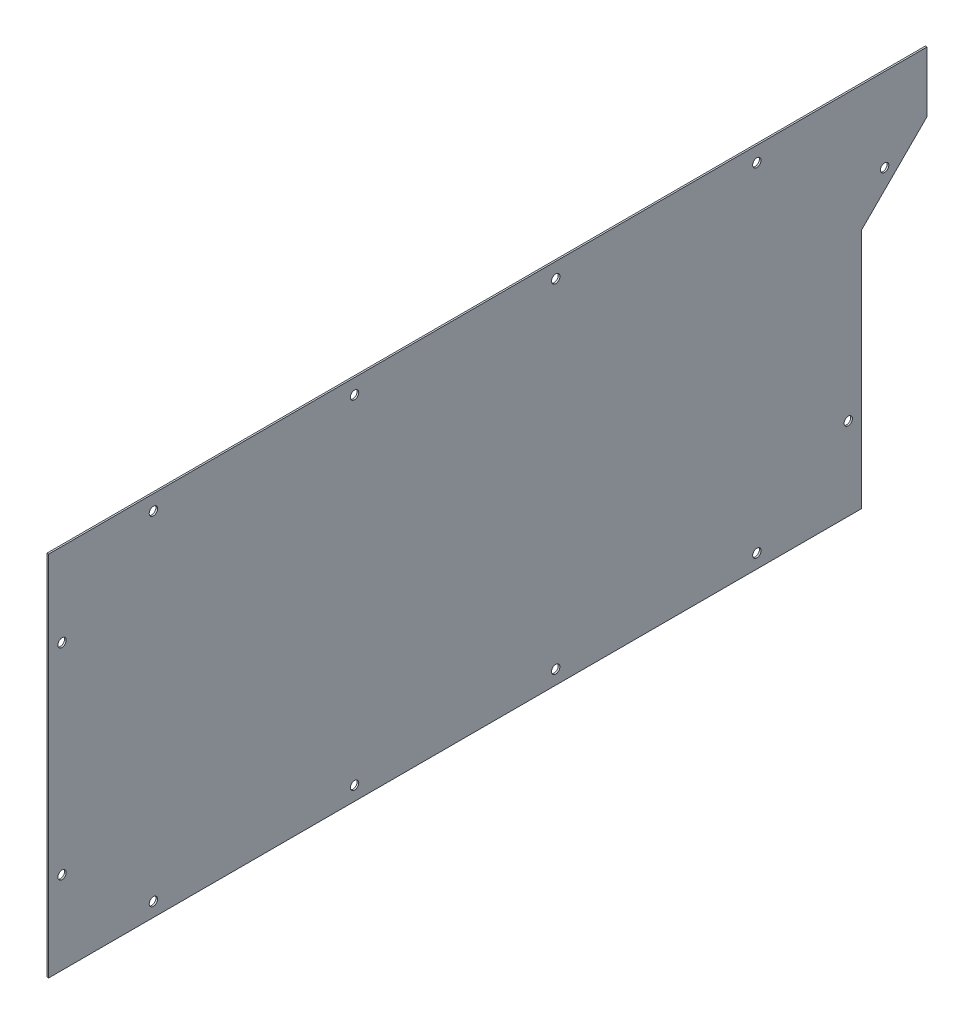
ISO-10303-21;
HEADER;
FILE_DESCRIPTION(('STEP AP214'),'2;1');
FILE_NAME('part.step','',(''),(''),'','','');
FILE_SCHEMA(('AUTOMOTIVE_DESIGN { 1 0 10303 214 1 1 1 1 }'));
ENDSEC;
DATA;
#1=APPLICATION_CONTEXT('core data for automotive mechanical design processes');
#2=APPLICATION_PROTOCOL_DEFINITION('international standard','automotive_design',2000,#1);
#3=PRODUCT_CONTEXT('',#1,'mechanical');
#4=PRODUCT('Part','Part','',(#3));
#5=PRODUCT_RELATED_PRODUCT_CATEGORY('part','',(#4));
#6=PRODUCT_DEFINITION_FORMATION('','',#4);
#7=PRODUCT_DEFINITION_CONTEXT('part definition',#1,'design');
#8=PRODUCT_DEFINITION('design','',#6,#7);
#9=PRODUCT_DEFINITION_SHAPE('','',#8);
#10=(LENGTH_UNIT() NAMED_UNIT(*) SI_UNIT(.MILLI.,.METRE.));
#11=(NAMED_UNIT(*) PLANE_ANGLE_UNIT() SI_UNIT($,.RADIAN.));
#12=(NAMED_UNIT(*) SI_UNIT($,.STERADIAN.) SOLID_ANGLE_UNIT());
#13=UNCERTAINTY_MEASURE_WITH_UNIT(LENGTH_MEASURE(1.E-05),#10,'distance_accuracy_value','');
#14=(GEOMETRIC_REPRESENTATION_CONTEXT(3) GLOBAL_UNCERTAINTY_ASSIGNED_CONTEXT((#13)) GLOBAL_UNIT_ASSIGNED_CONTEXT((#10,
#11,#12)) REPRESENTATION_CONTEXT('',''));
#15=CARTESIAN_POINT('',(0.,0.,0.));
#16=DIRECTION('',(0.,0.,1.));
#17=DIRECTION('',(1.,0.,0.));
#18=AXIS2_PLACEMENT_3D('',#15,#16,#17);
#19=CARTESIAN_POINT('',(1.,73.4999999999999,-262.));
#20=DIRECTION('',(0.,0.,1.));
#21=DIRECTION('',(1.,0.,0.));
#22=AXIS2_PLACEMENT_3D('',#19,#20,#21);
#23=PLANE('',#22);
#24=DIRECTION('',(0.,1.,0.));
#25=VECTOR('',#24,1.);
#26=CARTESIAN_POINT('',(0.,73.4999999999999,-262.));
#27=LINE('',#26,#25);
#28=CARTESIAN_POINT('',(0.,73.4999999999999,-262.));
#29=VERTEX_POINT('',#28);
#30=CARTESIAN_POINT('',(0.,109.5,-262.));
#31=VERTEX_POINT('',#30);
#32=EDGE_CURVE('E117',#29,#31,#27,.T.);
#33=ORIENTED_EDGE('',*,*,#32,.T.);
#34=DIRECTION('',(-1.,0.,0.));
#35=VECTOR('',#34,1.);
#36=CARTESIAN_POINT('',(1.,109.5,-262.));
#37=LINE('',#36,#35);
#38=CARTESIAN_POINT('',(1.,109.5,-262.));
#39=VERTEX_POINT('',#38);
#40=EDGE_CURVE('E11',#39,#31,#37,.T.);
#41=ORIENTED_EDGE('',*,*,#40,.F.);
#42=DIRECTION('',(0.,1.,0.));
#43=VECTOR('',#42,1.);
#44=CARTESIAN_POINT('',(1.,73.4999999999999,-262.));
#45=LINE('',#44,#43);
#46=CARTESIAN_POINT('',(1.,73.4999999999999,-262.));
#47=VERTEX_POINT('',#46);
#48=EDGE_CURVE('E128',#47,#39,#45,.T.);
#49=ORIENTED_EDGE('',*,*,#48,.F.);
#50=DIRECTION('',(-1.,0.,0.));
#51=VECTOR('',#50,1.);
#52=CARTESIAN_POINT('',(1.,73.4999999999999,-262.));
#53=LINE('',#52,#51);
#54=EDGE_CURVE('E113',#47,#29,#53,.T.);
#55=ORIENTED_EDGE('',*,*,#54,.T.);
#56=EDGE_LOOP('',(#33,#41,#49,#55));
#57=FACE_BOUND('',#56,.T.);
#58=ADVANCED_FACE('F33',(#57),#23,.F.);
#59=CARTESIAN_POINT('',(1.,109.5,262.));
#60=DIRECTION('',(0.,-1.,0.));
#61=DIRECTION('',(0.,0.,-1.));
#62=AXIS2_PLACEMENT_3D('',#59,#60,#61);
#63=PLANE('',#62);
#64=DIRECTION('',(0.,0.,1.));
#65=VECTOR('',#64,1.);
#66=CARTESIAN_POINT('',(0.,109.5,262.));
#67=LINE('',#66,#65);
#68=CARTESIAN_POINT('',(0.,109.5,262.));
#69=VERTEX_POINT('',#68);
#70=EDGE_CURVE('E120',#31,#69,#67,.T.);
#71=ORIENTED_EDGE('',*,*,#70,.T.);
#72=DIRECTION('',(-1.,0.,0.));
#73=VECTOR('',#72,1.);
#74=CARTESIAN_POINT('',(1.,109.5,262.));
#75=LINE('',#74,#73);
#76=CARTESIAN_POINT('',(1.,109.5,262.));
#77=VERTEX_POINT('',#76);
#78=EDGE_CURVE('E41',#77,#69,#75,.T.);
#79=ORIENTED_EDGE('',*,*,#78,.F.);
#80=DIRECTION('',(0.,0.,1.));
#81=VECTOR('',#80,1.);
#82=CARTESIAN_POINT('',(1.,109.5,262.));
#83=LINE('',#82,#81);
#84=EDGE_CURVE('E86',#39,#77,#83,.T.);
#85=ORIENTED_EDGE('',*,*,#84,.F.);
#86=ORIENTED_EDGE('',*,*,#40,.T.);
#87=EDGE_LOOP('',(#71,#79,#85,#86));
#88=FACE_BOUND('',#87,.T.);
#89=ADVANCED_FACE('F153',(#88),#63,.F.);
#90=CARTESIAN_POINT('',(1.,-109.5,262.));
#91=DIRECTION('',(0.,0.,-1.));
#92=DIRECTION('',(-1.,0.,0.));
#93=AXIS2_PLACEMENT_3D('',#90,#91,#92);
#94=PLANE('',#93);
#95=DIRECTION('',(0.,-1.,0.));
#96=VECTOR('',#95,1.);
#97=CARTESIAN_POINT('',(0.,-109.5,262.));
#98=LINE('',#97,#96);
#99=CARTESIAN_POINT('',(0.,-109.5,262.));
#100=VERTEX_POINT('',#99);
#101=EDGE_CURVE('E123',#69,#100,#98,.T.);
#102=ORIENTED_EDGE('',*,*,#101,.T.);
#103=DIRECTION('',(-1.,0.,0.));
#104=VECTOR('',#103,1.);
#105=CARTESIAN_POINT('',(1.,-109.5,262.));
#106=LINE('',#105,#104);
#107=CARTESIAN_POINT('',(1.,-109.5,262.));
#108=VERTEX_POINT('',#107);
#109=EDGE_CURVE('E108',#108,#100,#106,.T.);
#110=ORIENTED_EDGE('',*,*,#109,.F.);
#111=DIRECTION('',(0.,-1.,0.));
#112=VECTOR('',#111,1.);
#113=CARTESIAN_POINT('',(1.,-109.5,262.));
#114=LINE('',#113,#112);
#115=EDGE_CURVE('E99',#77,#108,#114,.T.);
#116=ORIENTED_EDGE('',*,*,#115,.F.);
#117=ORIENTED_EDGE('',*,*,#78,.T.);
#118=EDGE_LOOP('',(#102,#110,#116,#117));
#119=FACE_BOUND('',#118,.T.);
#120=ADVANCED_FACE('F134',(#119),#94,.F.);
#121=CARTESIAN_POINT('',(1.,-109.5,262.));
#122=DIRECTION('',(0.,1.,0.));
#123=DIRECTION('',(0.,0.,1.));
#124=AXIS2_PLACEMENT_3D('',#121,#122,#123);
#125=PLANE('',#124);
#126=DIRECTION('',(0.,0.,-1.));
#127=VECTOR('',#126,1.);
#128=CARTESIAN_POINT('',(0.,-109.5,262.));
#129=LINE('',#128,#127);
#130=CARTESIAN_POINT('',(0.,-109.5,-223.));
#131=VERTEX_POINT('',#130);
#132=EDGE_CURVE('E107',#100,#131,#129,.T.);
#133=ORIENTED_EDGE('',*,*,#132,.T.);
#134=DIRECTION('',(-1.,0.,0.));
#135=VECTOR('',#134,1.);
#136=CARTESIAN_POINT('',(1.,-109.5,-223.));
#137=LINE('',#136,#135);
#138=CARTESIAN_POINT('',(1.,-109.5,-223.));
#139=VERTEX_POINT('',#138);
#140=EDGE_CURVE('E104',#139,#131,#137,.T.);
#141=ORIENTED_EDGE('',*,*,#140,.F.);
#142=DIRECTION('',(0.,0.,-1.));
#143=VECTOR('',#142,1.);
#144=CARTESIAN_POINT('',(1.,-109.5,262.));
#145=LINE('',#144,#143);
#146=EDGE_CURVE('E93',#108,#139,#145,.T.);
#147=ORIENTED_EDGE('',*,*,#146,.F.);
#148=ORIENTED_EDGE('',*,*,#109,.T.);
#149=EDGE_LOOP('',(#133,#141,#147,#148));
#150=FACE_BOUND('',#149,.T.);
#151=ADVANCED_FACE('F105',(#150),#125,.F.);
#152=CARTESIAN_POINT('',(1.,-109.5,-223.));
#153=DIRECTION('',(0.,0.,1.));
#154=DIRECTION('',(0.,-1.,0.));
#155=AXIS2_PLACEMENT_3D('',#152,#153,#154);
#156=PLANE('',#155);
#157=DIRECTION('',(0.,1.,0.));
#158=VECTOR('',#157,1.);
#159=CARTESIAN_POINT('',(0.,-109.5,-223.));
#160=LINE('',#159,#158);
#161=CARTESIAN_POINT('',(0.,34.5,-223.));
#162=VERTEX_POINT('',#161);
#163=EDGE_CURVE('E72',#131,#162,#160,.T.);
#164=ORIENTED_EDGE('',*,*,#163,.T.);
#165=DIRECTION('',(-1.,0.,0.));
#166=VECTOR('',#165,1.);
#167=CARTESIAN_POINT('',(1.,34.5,-223.));
#168=LINE('',#167,#166);
#169=CARTESIAN_POINT('',(1.,34.5,-223.));
#170=VERTEX_POINT('',#169);
#171=EDGE_CURVE('E109',#170,#162,#168,.T.);
#172=ORIENTED_EDGE('',*,*,#171,.F.);
#173=DIRECTION('',(0.,1.,0.));
#174=VECTOR('',#173,1.);
#175=CARTESIAN_POINT('',(1.,-109.5,-223.));
#176=LINE('',#175,#174);
#177=EDGE_CURVE('E97',#139,#170,#176,.T.);
#178=ORIENTED_EDGE('',*,*,#177,.F.);
#179=ORIENTED_EDGE('',*,*,#140,.T.);
#180=EDGE_LOOP('',(#164,#172,#178,#179));
#181=FACE_BOUND('',#180,.T.);
#182=ADVANCED_FACE('F111',(#181),#156,.F.);
#183=CARTESIAN_POINT('',(1.,34.5,-223.));
#184=DIRECTION('',(0.,0.707106781186549,0.707106781186546));
#185=DIRECTION('',(0.,-0.707106781186546,0.707106781186549));
#186=AXIS2_PLACEMENT_3D('',#183,#184,#185);
#187=PLANE('',#186);
#188=DIRECTION('',(0.,0.707106781186546,-0.707106781186549));
#189=VECTOR('',#188,1.);
#190=CARTESIAN_POINT('',(0.,34.5,-223.));
#191=LINE('',#190,#189);
#192=EDGE_CURVE('E78',#162,#29,#191,.T.);
#193=ORIENTED_EDGE('',*,*,#192,.T.);
#194=ORIENTED_EDGE('',*,*,#54,.F.);
#195=DIRECTION('',(0.,0.707106781186546,-0.707106781186549));
#196=VECTOR('',#195,1.);
#197=CARTESIAN_POINT('',(1.,34.5,-223.));
#198=LINE('',#197,#196);
#199=EDGE_CURVE('E49',#170,#47,#198,.T.);
#200=ORIENTED_EDGE('',*,*,#199,.F.);
#201=ORIENTED_EDGE('',*,*,#171,.T.);
#202=EDGE_LOOP('',(#193,#194,#200,#201));
#203=FACE_BOUND('',#202,.T.);
#204=ADVANCED_FACE('F141',(#203),#187,.F.);
#205=CARTESIAN_POINT('',(1.,0.,0.));
#206=DIRECTION('',(-1.,0.,0.));
#207=DIRECTION('',(0.,0.,1.));
#208=AXIS2_PLACEMENT_3D('',#205,#206,#207);
#209=PLANE('',#208);
#210=CARTESIAN_POINT('',(1.,59.7928932188117,-236.686291501008));
#211=DIRECTION('',(1.,0.,0.));
#212=DIRECTION('',(0.,0.,-1.));
#213=AXIS2_PLACEMENT_3D('',#210,#211,#212);
#214=CIRCLE('',#213,2.49999999999828);
#215=CARTESIAN_POINT('',(1.,59.7928932188117,-239.186291501006));
#216=VERTEX_POINT('',#215);
#217=EDGE_CURVE('E319',#216,#216,#214,.T.);
#218=ORIENTED_EDGE('',*,*,#217,.F.);
#219=EDGE_LOOP('',(#218));
#220=FACE_BOUND('',#219,.T.);
#221=CARTESIAN_POINT('',(1.,59.7928932188074,254.000000000004));
#222=DIRECTION('',(1.,0.,0.));
#223=DIRECTION('',(0.,0.,-1.));
#224=AXIS2_PLACEMENT_3D('',#221,#222,#223);
#225=CIRCLE('',#224,2.50000000000269);
#226=CARTESIAN_POINT('',(1.,59.7928932188074,251.500000000001));
#227=VERTEX_POINT('',#226);
#228=EDGE_CURVE('E325',#227,#227,#225,.T.);
#229=ORIENTED_EDGE('',*,*,#228,.F.);
#230=EDGE_LOOP('',(#229));
#231=FACE_BOUND('',#230,.T.);
#232=CARTESIAN_POINT('',(1.,-60.2071067811926,254.000000000003));
#233=DIRECTION('',(1.,0.,0.));
#234=DIRECTION('',(0.,0.,-1.));
#235=AXIS2_PLACEMENT_3D('',#232,#233,#234);
#236=CIRCLE('',#235,2.50000000000148);
#237=CARTESIAN_POINT('',(1.,-60.2071067811926,251.500000000001));
#238=VERTEX_POINT('',#237);
#239=EDGE_CURVE('E336',#238,#238,#236,.T.);
#240=ORIENTED_EDGE('',*,*,#239,.F.);
#241=EDGE_LOOP('',(#240));
#242=FACE_BOUND('',#241,.T.);
#243=CARTESIAN_POINT('',(1.,100.5,199.500000000002));
#244=DIRECTION('',(1.,0.,0.));
#245=DIRECTION('',(0.,0.,-1.));
#246=AXIS2_PLACEMENT_3D('',#243,#244,#245);
#247=CIRCLE('',#246,2.50000000000008);
#248=CARTESIAN_POINT('',(1.,100.5,197.000000000002));
#249=VERTEX_POINT('',#248);
#250=EDGE_CURVE('E404',#249,#249,#247,.T.);
#251=ORIENTED_EDGE('',*,*,#250,.F.);
#252=EDGE_LOOP('',(#251));
#253=FACE_BOUND('',#252,.T.);
#254=CARTESIAN_POINT('',(1.,-101.207106781186,-160.5));
#255=DIRECTION('',(1.,0.,0.));
#256=DIRECTION('',(0.,0.,-1.));
#257=AXIS2_PLACEMENT_3D('',#254,#255,#256);
#258=CIRCLE('',#257,2.5);
#259=CARTESIAN_POINT('',(1.,-101.207106781186,-163.));
#260=VERTEX_POINT('',#259);
#261=EDGE_CURVE('E346',#260,#260,#258,.T.);
#262=ORIENTED_EDGE('',*,*,#261,.F.);
#263=EDGE_LOOP('',(#262));
#264=FACE_BOUND('',#263,.T.);
#265=CARTESIAN_POINT('',(1.,-101.207106781187,199.5));
#266=DIRECTION('',(1.,0.,0.));
#267=DIRECTION('',(0.,0.,-1.));
#268=AXIS2_PLACEMENT_3D('',#265,#266,#267);
#269=CIRCLE('',#268,2.5000000000015);
#270=CARTESIAN_POINT('',(1.,-101.207106781187,196.999999999999));
#271=VERTEX_POINT('',#270);
#272=EDGE_CURVE('E353',#271,#271,#269,.T.);
#273=ORIENTED_EDGE('',*,*,#272,.F.);
#274=EDGE_LOOP('',(#273));
#275=FACE_BOUND('',#274,.T.);
#276=CARTESIAN_POINT('',(1.,-101.207106781187,79.5000000000003));
#277=DIRECTION('',(1.,0.,0.));
#278=DIRECTION('',(0.,0.,-1.));
#279=AXIS2_PLACEMENT_3D('',#276,#277,#278);
#280=CIRCLE('',#279,2.50000000000104);
#281=CARTESIAN_POINT('',(1.,-101.207106781187,76.9999999999992));
#282=VERTEX_POINT('',#281);
#283=EDGE_CURVE('E337',#282,#282,#280,.T.);
#284=ORIENTED_EDGE('',*,*,#283,.F.);
#285=EDGE_LOOP('',(#284));
#286=FACE_BOUND('',#285,.T.);
#287=CARTESIAN_POINT('',(1.,-60.2071067811883,-214.999999999992));
#288=DIRECTION('',(1.,0.,0.));
#289=DIRECTION('',(0.,0.,-1.));
#290=AXIS2_PLACEMENT_3D('',#287,#288,#289);
#291=CIRCLE('',#290,2.5);
#292=CARTESIAN_POINT('',(1.,-60.2071067811883,-217.499999999992));
#293=VERTEX_POINT('',#292);
#294=EDGE_CURVE('E323',#293,#293,#291,.T.);
#295=ORIENTED_EDGE('',*,*,#294,.F.);
#296=EDGE_LOOP('',(#295));
#297=FACE_BOUND('',#296,.T.);
#298=CARTESIAN_POINT('',(1.,100.5,79.5000000000017));
#299=DIRECTION('',(1.,0.,0.));
#300=DIRECTION('',(0.,0.,-1.));
#301=AXIS2_PLACEMENT_3D('',#298,#299,#300);
#302=CIRCLE('',#301,2.50000000000005);
#303=CARTESIAN_POINT('',(1.,100.5,77.0000000000017));
#304=VERTEX_POINT('',#303);
#305=EDGE_CURVE('E382',#304,#304,#302,.T.);
#306=ORIENTED_EDGE('',*,*,#305,.F.);
#307=EDGE_LOOP('',(#306));
#308=FACE_BOUND('',#307,.T.);
#309=CARTESIAN_POINT('',(1.,100.500000000001,-40.4999999999983));
#310=DIRECTION('',(1.,0.,0.));
#311=DIRECTION('',(0.,0.,-1.));
#312=AXIS2_PLACEMENT_3D('',#309,#310,#311);
#313=CIRCLE('',#312,2.50000000000006);
#314=CARTESIAN_POINT('',(1.,100.500000000001,-42.9999999999983));
#315=VERTEX_POINT('',#314);
#316=EDGE_CURVE('E386',#315,#315,#313,.T.);
#317=ORIENTED_EDGE('',*,*,#316,.F.);
#318=EDGE_LOOP('',(#317));
#319=FACE_BOUND('',#318,.T.);
#320=CARTESIAN_POINT('',(1.,100.5,-160.499999999998));
#321=DIRECTION('',(1.,0.,0.));
#322=DIRECTION('',(0.,0.,-1.));
#323=AXIS2_PLACEMENT_3D('',#320,#321,#322);
#324=CIRCLE('',#323,2.50000000000008);
#325=CARTESIAN_POINT('',(1.,100.5,-162.999999999998));
#326=VERTEX_POINT('',#325);
#327=EDGE_CURVE('E389',#326,#326,#324,.T.);
#328=ORIENTED_EDGE('',*,*,#327,.F.);
#329=EDGE_LOOP('',(#328));
#330=FACE_BOUND('',#329,.T.);
#331=CARTESIAN_POINT('',(1.,-101.207106781186,-40.4999999999997));
#332=DIRECTION('',(1.,0.,0.));
#333=DIRECTION('',(0.,0.,-1.));
#334=AXIS2_PLACEMENT_3D('',#331,#332,#333);
#335=CIRCLE('',#334,2.50000000000052);
#336=CARTESIAN_POINT('',(1.,-101.207106781186,-43.0000000000003));
#337=VERTEX_POINT('',#336);
#338=EDGE_CURVE('E121',#337,#337,#335,.T.);
#339=ORIENTED_EDGE('',*,*,#338,.F.);
#340=EDGE_LOOP('',(#339));
#341=FACE_BOUND('',#340,.T.);
#342=ORIENTED_EDGE('',*,*,#48,.T.);
#343=ORIENTED_EDGE('',*,*,#84,.T.);
#344=ORIENTED_EDGE('',*,*,#115,.T.);
#345=ORIENTED_EDGE('',*,*,#146,.T.);
#346=ORIENTED_EDGE('',*,*,#177,.T.);
#347=ORIENTED_EDGE('',*,*,#199,.T.);
#348=EDGE_LOOP('',(#342,#343,#344,#345,#346,#347));
#349=FACE_BOUND('',#348,.T.);
#350=ADVANCED_FACE('F95',(#220,#231,#242,#253,#264,#275,#286,#297,#308,#319,#330,#341,#349),
#209,.F.);
#351=CARTESIAN_POINT('',(0.,0.,0.));
#352=DIRECTION('',(-1.,0.,0.));
#353=DIRECTION('',(0.,0.,1.));
#354=AXIS2_PLACEMENT_3D('',#351,#352,#353);
#355=PLANE('',#354);
#356=CARTESIAN_POINT('',(0.,59.7928932188117,-236.686291501008));
#357=DIRECTION('',(-1.,0.,0.));
#358=DIRECTION('',(0.,0.,1.));
#359=AXIS2_PLACEMENT_3D('',#356,#357,#358);
#360=CIRCLE('',#359,2.49999999999828);
#361=CARTESIAN_POINT('',(0.,59.7928932188117,-234.18629150101));
#362=VERTEX_POINT('',#361);
#363=EDGE_CURVE('E316',#362,#362,#360,.F.);
#364=ORIENTED_EDGE('',*,*,#363,.T.);
#365=EDGE_LOOP('',(#364));
#366=FACE_BOUND('',#365,.T.);
#367=CARTESIAN_POINT('',(0.,59.7928932188074,254.000000000004));
#368=DIRECTION('',(-1.,0.,0.));
#369=DIRECTION('',(0.,0.,1.));
#370=AXIS2_PLACEMENT_3D('',#367,#368,#369);
#371=CIRCLE('',#370,2.50000000000269);
#372=CARTESIAN_POINT('',(0.,59.7928932188074,256.500000000007));
#373=VERTEX_POINT('',#372);
#374=EDGE_CURVE('E333',#373,#373,#371,.F.);
#375=ORIENTED_EDGE('',*,*,#374,.T.);
#376=EDGE_LOOP('',(#375));
#377=FACE_BOUND('',#376,.T.);
#378=CARTESIAN_POINT('',(0.,-60.2071067811926,254.000000000003));
#379=DIRECTION('',(-1.,0.,0.));
#380=DIRECTION('',(0.,0.,1.));
#381=AXIS2_PLACEMENT_3D('',#378,#379,#380);
#382=CIRCLE('',#381,2.50000000000148);
#383=CARTESIAN_POINT('',(0.,-60.2071067811926,256.500000000004));
#384=VERTEX_POINT('',#383);
#385=EDGE_CURVE('E402',#384,#384,#382,.F.);
#386=ORIENTED_EDGE('',*,*,#385,.T.);
#387=EDGE_LOOP('',(#386));
#388=FACE_BOUND('',#387,.T.);
#389=CARTESIAN_POINT('',(0.,100.5,199.500000000002));
#390=DIRECTION('',(-1.,0.,0.));
#391=DIRECTION('',(0.,0.,1.));
#392=AXIS2_PLACEMENT_3D('',#389,#390,#391);
#393=CIRCLE('',#392,2.50000000000008);
#394=CARTESIAN_POINT('',(0.,100.5,202.000000000002));
#395=VERTEX_POINT('',#394);
#396=EDGE_CURVE('E328',#395,#395,#393,.F.);
#397=ORIENTED_EDGE('',*,*,#396,.T.);
#398=EDGE_LOOP('',(#397));
#399=FACE_BOUND('',#398,.T.);
#400=CARTESIAN_POINT('',(0.,-101.207106781186,-160.5));
#401=DIRECTION('',(-1.,0.,0.));
#402=DIRECTION('',(0.,0.,1.));
#403=AXIS2_PLACEMENT_3D('',#400,#401,#402);
#404=CIRCLE('',#403,2.5);
#405=CARTESIAN_POINT('',(0.,-101.207106781186,-158.));
#406=VERTEX_POINT('',#405);
#407=EDGE_CURVE('E350',#406,#406,#404,.F.);
#408=ORIENTED_EDGE('',*,*,#407,.T.);
#409=EDGE_LOOP('',(#408));
#410=FACE_BOUND('',#409,.T.);
#411=CARTESIAN_POINT('',(0.,-101.207106781187,199.5));
#412=DIRECTION('',(-1.,0.,0.));
#413=DIRECTION('',(0.,0.,1.));
#414=AXIS2_PLACEMENT_3D('',#411,#412,#413);
#415=CIRCLE('',#414,2.5000000000015);
#416=CARTESIAN_POINT('',(0.,-101.207106781187,202.000000000002));
#417=VERTEX_POINT('',#416);
#418=EDGE_CURVE('E340',#417,#417,#415,.F.);
#419=ORIENTED_EDGE('',*,*,#418,.T.);
#420=EDGE_LOOP('',(#419));
#421=FACE_BOUND('',#420,.T.);
#422=CARTESIAN_POINT('',(0.,-101.207106781187,79.5000000000003));
#423=DIRECTION('',(-1.,0.,0.));
#424=DIRECTION('',(0.,0.,1.));
#425=AXIS2_PLACEMENT_3D('',#422,#423,#424);
#426=CIRCLE('',#425,2.50000000000104);
#427=CARTESIAN_POINT('',(0.,-101.207106781187,82.0000000000013));
#428=VERTEX_POINT('',#427);
#429=EDGE_CURVE('E341',#428,#428,#426,.F.);
#430=ORIENTED_EDGE('',*,*,#429,.T.);
#431=EDGE_LOOP('',(#430));
#432=FACE_BOUND('',#431,.T.);
#433=CARTESIAN_POINT('',(0.,-60.2071067811883,-214.999999999992));
#434=DIRECTION('',(-1.,0.,0.));
#435=DIRECTION('',(0.,0.,1.));
#436=AXIS2_PLACEMENT_3D('',#433,#434,#435);
#437=CIRCLE('',#436,2.5);
#438=CARTESIAN_POINT('',(0.,-60.2071067811883,-212.499999999992));
#439=VERTEX_POINT('',#438);
#440=EDGE_CURVE('E320',#439,#439,#437,.F.);
#441=ORIENTED_EDGE('',*,*,#440,.T.);
#442=EDGE_LOOP('',(#441));
#443=FACE_BOUND('',#442,.T.);
#444=CARTESIAN_POINT('',(0.,100.5,79.5000000000017));
#445=DIRECTION('',(-1.,0.,0.));
#446=DIRECTION('',(0.,0.,1.));
#447=AXIS2_PLACEMENT_3D('',#444,#445,#446);
#448=CIRCLE('',#447,2.50000000000005);
#449=CARTESIAN_POINT('',(0.,100.5,82.0000000000018));
#450=VERTEX_POINT('',#449);
#451=EDGE_CURVE('E411',#450,#450,#448,.F.);
#452=ORIENTED_EDGE('',*,*,#451,.T.);
#453=EDGE_LOOP('',(#452));
#454=FACE_BOUND('',#453,.T.);
#455=CARTESIAN_POINT('',(0.,100.500000000001,-40.4999999999983));
#456=DIRECTION('',(-1.,0.,0.));
#457=DIRECTION('',(0.,0.,1.));
#458=AXIS2_PLACEMENT_3D('',#455,#456,#457);
#459=CIRCLE('',#458,2.50000000000006);
#460=CARTESIAN_POINT('',(0.,100.500000000001,-37.9999999999982));
#461=VERTEX_POINT('',#460);
#462=EDGE_CURVE('E391',#461,#461,#459,.F.);
#463=ORIENTED_EDGE('',*,*,#462,.T.);
#464=EDGE_LOOP('',(#463));
#465=FACE_BOUND('',#464,.T.);
#466=CARTESIAN_POINT('',(0.,100.5,-160.499999999998));
#467=DIRECTION('',(-1.,0.,0.));
#468=DIRECTION('',(0.,0.,1.));
#469=AXIS2_PLACEMENT_3D('',#466,#467,#468);
#470=CIRCLE('',#469,2.50000000000008);
#471=CARTESIAN_POINT('',(0.,100.5,-157.999999999998));
#472=VERTEX_POINT('',#471);
#473=EDGE_CURVE('E392',#472,#472,#470,.F.);
#474=ORIENTED_EDGE('',*,*,#473,.T.);
#475=EDGE_LOOP('',(#474));
#476=FACE_BOUND('',#475,.T.);
#477=CARTESIAN_POINT('',(0.,-101.207106781186,-40.4999999999997));
#478=DIRECTION('',(-1.,0.,0.));
#479=DIRECTION('',(0.,0.,1.));
#480=AXIS2_PLACEMENT_3D('',#477,#478,#479);
#481=CIRCLE('',#480,2.50000000000052);
#482=CARTESIAN_POINT('',(0.,-101.207106781186,-37.9999999999992));
#483=VERTEX_POINT('',#482);
#484=EDGE_CURVE('E349',#483,#483,#481,.F.);
#485=ORIENTED_EDGE('',*,*,#484,.T.);
#486=EDGE_LOOP('',(#485));
#487=FACE_BOUND('',#486,.T.);
#488=ORIENTED_EDGE('',*,*,#32,.F.);
#489=ORIENTED_EDGE('',*,*,#192,.F.);
#490=ORIENTED_EDGE('',*,*,#163,.F.);
#491=ORIENTED_EDGE('',*,*,#132,.F.);
#492=ORIENTED_EDGE('',*,*,#101,.F.);
#493=ORIENTED_EDGE('',*,*,#70,.F.);
#494=EDGE_LOOP('',(#488,#489,#490,#491,#492,#493));
#495=FACE_BOUND('',#494,.T.);
#496=ADVANCED_FACE('F137',(#366,#377,#388,#399,#410,#421,#432,#443,#454,#465,#476,#487,#495),
#355,.T.);
#497=CARTESIAN_POINT('',(-0.000999999999999916,-101.207106781186,-40.4999999999997));
#498=DIRECTION('',(1.,0.,0.));
#499=DIRECTION('',(0.,0.,-1.));
#500=AXIS2_PLACEMENT_3D('',#497,#498,#499);
#501=CYLINDRICAL_SURFACE('',#500,2.50000000000052);
#502=ORIENTED_EDGE('',*,*,#484,.F.);
#503=EDGE_LOOP('',(#502));
#504=FACE_BOUND('',#503,.T.);
#505=ORIENTED_EDGE('',*,*,#338,.T.);
#506=EDGE_LOOP('',(#505));
#507=FACE_BOUND('',#506,.T.);
#508=ADVANCED_FACE('F190',(#504,#507),#501,.F.);
#509=CARTESIAN_POINT('',(-0.000999999999999916,100.5,-160.499999999998));
#510=DIRECTION('',(1.,0.,0.));
#511=DIRECTION('',(0.,0.,-1.));
#512=AXIS2_PLACEMENT_3D('',#509,#510,#511);
#513=CYLINDRICAL_SURFACE('',#512,2.50000000000008);
#514=ORIENTED_EDGE('',*,*,#473,.F.);
#515=EDGE_LOOP('',(#514));
#516=FACE_BOUND('',#515,.T.);
#517=ORIENTED_EDGE('',*,*,#327,.T.);
#518=EDGE_LOOP('',(#517));
#519=FACE_BOUND('',#518,.T.);
#520=ADVANCED_FACE('F199',(#516,#519),#513,.F.);
#521=CARTESIAN_POINT('',(-0.000999999999999916,100.500000000001,-40.4999999999983));
#522=DIRECTION('',(1.,0.,0.));
#523=DIRECTION('',(0.,0.,-1.));
#524=AXIS2_PLACEMENT_3D('',#521,#522,#523);
#525=CYLINDRICAL_SURFACE('',#524,2.50000000000006);
#526=ORIENTED_EDGE('',*,*,#462,.F.);
#527=EDGE_LOOP('',(#526));
#528=FACE_BOUND('',#527,.T.);
#529=ORIENTED_EDGE('',*,*,#316,.T.);
#530=EDGE_LOOP('',(#529));
#531=FACE_BOUND('',#530,.T.);
#532=ADVANCED_FACE('F209',(#528,#531),#525,.F.);
#533=CARTESIAN_POINT('',(-0.000999999999999916,100.5,79.5000000000017));
#534=DIRECTION('',(1.,0.,0.));
#535=DIRECTION('',(0.,0.,-1.));
#536=AXIS2_PLACEMENT_3D('',#533,#534,#535);
#537=CYLINDRICAL_SURFACE('',#536,2.50000000000005);
#538=ORIENTED_EDGE('',*,*,#451,.F.);
#539=EDGE_LOOP('',(#538));
#540=FACE_BOUND('',#539,.T.);
#541=ORIENTED_EDGE('',*,*,#305,.T.);
#542=EDGE_LOOP('',(#541));
#543=FACE_BOUND('',#542,.T.);
#544=ADVANCED_FACE('F219',(#540,#543),#537,.F.);
#545=CARTESIAN_POINT('',(-0.000999999999999916,-60.2071067811883,-214.999999999992));
#546=DIRECTION('',(1.,0.,0.));
#547=DIRECTION('',(0.,0.,-1.));
#548=AXIS2_PLACEMENT_3D('',#545,#546,#547);
#549=CYLINDRICAL_SURFACE('',#548,2.5);
#550=ORIENTED_EDGE('',*,*,#440,.F.);
#551=EDGE_LOOP('',(#550));
#552=FACE_BOUND('',#551,.T.);
#553=ORIENTED_EDGE('',*,*,#294,.T.);
#554=EDGE_LOOP('',(#553));
#555=FACE_BOUND('',#554,.T.);
#556=ADVANCED_FACE('F229',(#552,#555),#549,.F.);
#557=CARTESIAN_POINT('',(-0.000999999999999916,-101.207106781187,79.5000000000003));
#558=DIRECTION('',(1.,0.,0.));
#559=DIRECTION('',(0.,0.,-1.));
#560=AXIS2_PLACEMENT_3D('',#557,#558,#559);
#561=CYLINDRICAL_SURFACE('',#560,2.50000000000104);
#562=ORIENTED_EDGE('',*,*,#429,.F.);
#563=EDGE_LOOP('',(#562));
#564=FACE_BOUND('',#563,.T.);
#565=ORIENTED_EDGE('',*,*,#283,.T.);
#566=EDGE_LOOP('',(#565));
#567=FACE_BOUND('',#566,.T.);
#568=ADVANCED_FACE('F239',(#564,#567),#561,.F.);
#569=CARTESIAN_POINT('',(-0.000999999999999916,-101.207106781187,199.5));
#570=DIRECTION('',(1.,0.,0.));
#571=DIRECTION('',(0.,0.,-1.));
#572=AXIS2_PLACEMENT_3D('',#569,#570,#571);
#573=CYLINDRICAL_SURFACE('',#572,2.5000000000015);
#574=ORIENTED_EDGE('',*,*,#418,.F.);
#575=EDGE_LOOP('',(#574));
#576=FACE_BOUND('',#575,.T.);
#577=ORIENTED_EDGE('',*,*,#272,.T.);
#578=EDGE_LOOP('',(#577));
#579=FACE_BOUND('',#578,.T.);
#580=ADVANCED_FACE('F249',(#576,#579),#573,.F.);
#581=CARTESIAN_POINT('',(-0.000999999999999916,-101.207106781186,-160.5));
#582=DIRECTION('',(1.,0.,0.));
#583=DIRECTION('',(0.,0.,-1.));
#584=AXIS2_PLACEMENT_3D('',#581,#582,#583);
#585=CYLINDRICAL_SURFACE('',#584,2.5);
#586=ORIENTED_EDGE('',*,*,#407,.F.);
#587=EDGE_LOOP('',(#586));
#588=FACE_BOUND('',#587,.T.);
#589=ORIENTED_EDGE('',*,*,#261,.T.);
#590=EDGE_LOOP('',(#589));
#591=FACE_BOUND('',#590,.T.);
#592=ADVANCED_FACE('F259',(#588,#591),#585,.F.);
#593=CARTESIAN_POINT('',(-0.000999999999999916,100.5,199.500000000002));
#594=DIRECTION('',(1.,0.,0.));
#595=DIRECTION('',(0.,0.,-1.));
#596=AXIS2_PLACEMENT_3D('',#593,#594,#595);
#597=CYLINDRICAL_SURFACE('',#596,2.50000000000008);
#598=ORIENTED_EDGE('',*,*,#396,.F.);
#599=EDGE_LOOP('',(#598));
#600=FACE_BOUND('',#599,.T.);
#601=ORIENTED_EDGE('',*,*,#250,.T.);
#602=EDGE_LOOP('',(#601));
#603=FACE_BOUND('',#602,.T.);
#604=ADVANCED_FACE('F269',(#600,#603),#597,.F.);
#605=CARTESIAN_POINT('',(-0.000999999999999916,-60.2071067811926,254.000000000003));
#606=DIRECTION('',(1.,0.,0.));
#607=DIRECTION('',(0.,0.,-1.));
#608=AXIS2_PLACEMENT_3D('',#605,#606,#607);
#609=CYLINDRICAL_SURFACE('',#608,2.50000000000148);
#610=ORIENTED_EDGE('',*,*,#385,.F.);
#611=EDGE_LOOP('',(#610));
#612=FACE_BOUND('',#611,.T.);
#613=ORIENTED_EDGE('',*,*,#239,.T.);
#614=EDGE_LOOP('',(#613));
#615=FACE_BOUND('',#614,.T.);
#616=ADVANCED_FACE('F279',(#612,#615),#609,.F.);
#617=CARTESIAN_POINT('',(-0.000999999999999916,59.7928932188074,254.000000000004));
#618=DIRECTION('',(1.,0.,0.));
#619=DIRECTION('',(0.,0.,-1.));
#620=AXIS2_PLACEMENT_3D('',#617,#618,#619);
#621=CYLINDRICAL_SURFACE('',#620,2.50000000000269);
#622=ORIENTED_EDGE('',*,*,#374,.F.);
#623=EDGE_LOOP('',(#622));
#624=FACE_BOUND('',#623,.T.);
#625=ORIENTED_EDGE('',*,*,#228,.T.);
#626=EDGE_LOOP('',(#625));
#627=FACE_BOUND('',#626,.T.);
#628=ADVANCED_FACE('F289',(#624,#627),#621,.F.);
#629=CARTESIAN_POINT('',(-0.000999999999999916,59.7928932188117,-236.686291501008));
#630=DIRECTION('',(1.,0.,0.));
#631=DIRECTION('',(0.,0.,-1.));
#632=AXIS2_PLACEMENT_3D('',#629,#630,#631);
#633=CYLINDRICAL_SURFACE('',#632,2.49999999999828);
#634=ORIENTED_EDGE('',*,*,#363,.F.);
#635=EDGE_LOOP('',(#634));
#636=FACE_BOUND('',#635,.T.);
#637=ORIENTED_EDGE('',*,*,#217,.T.);
#638=EDGE_LOOP('',(#637));
#639=FACE_BOUND('',#638,.T.);
#640=ADVANCED_FACE('F299',(#636,#639),#633,.F.);
#641=CLOSED_SHELL('',(#58,#89,#120,#151,#182,#204,#350,#496,#508,#520,#532,#544,#556,#568,#580,
#592,#604,#616,#628,#640));
#642=MANIFOLD_SOLID_BREP('B2',#641);
#643=ADVANCED_BREP_SHAPE_REPRESENTATION('',(#18,#642),#14);
#644=SHAPE_DEFINITION_REPRESENTATION(#9,#643);
ENDSEC;
END-ISO-10303-21;
